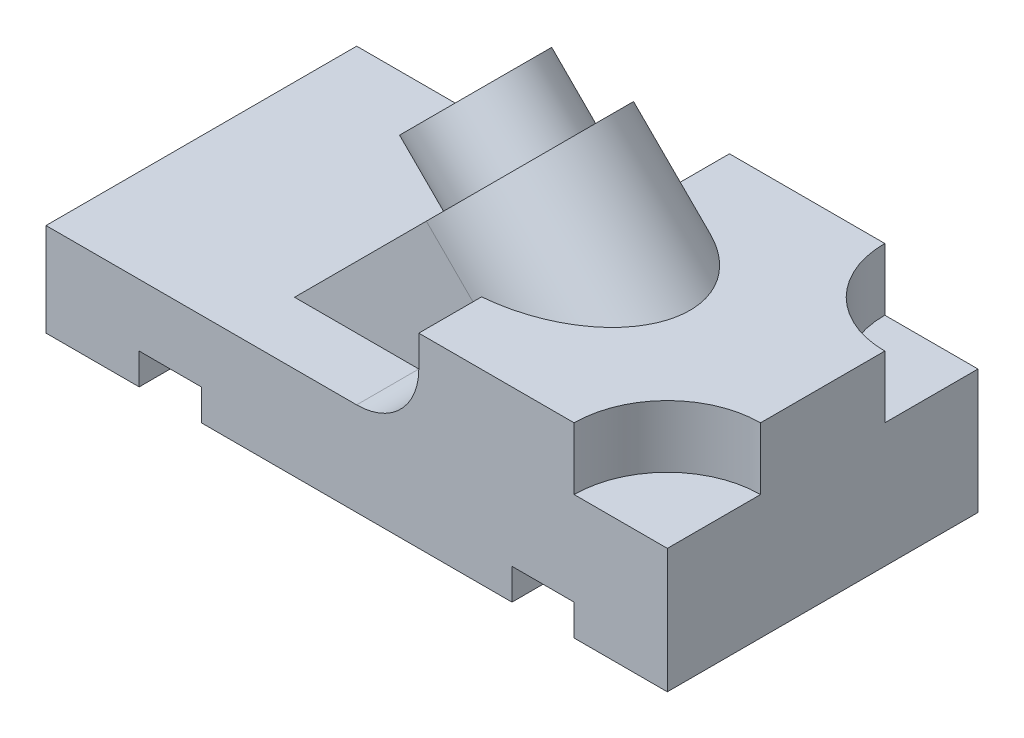
ISO-10303-21;
HEADER;
FILE_DESCRIPTION(('STEP AP214'),'2;1');
FILE_NAME('part.step','',(''),(''),'','','');
FILE_SCHEMA(('AUTOMOTIVE_DESIGN { 1 0 10303 214 1 1 1 1 }'));
ENDSEC;
DATA;
#1=APPLICATION_CONTEXT('core data for automotive mechanical design processes');
#2=APPLICATION_PROTOCOL_DEFINITION('international standard','automotive_design',2000,#1);
#3=PRODUCT_CONTEXT('',#1,'mechanical');
#4=PRODUCT('Part','Part','',(#3));
#5=PRODUCT_RELATED_PRODUCT_CATEGORY('part','',(#4));
#6=PRODUCT_DEFINITION_FORMATION('','',#4);
#7=PRODUCT_DEFINITION_CONTEXT('part definition',#1,'design');
#8=PRODUCT_DEFINITION('design','',#6,#7);
#9=PRODUCT_DEFINITION_SHAPE('','',#8);
#10=(LENGTH_UNIT() NAMED_UNIT(*) SI_UNIT(.MILLI.,.METRE.));
#11=(NAMED_UNIT(*) PLANE_ANGLE_UNIT() SI_UNIT($,.RADIAN.));
#12=(NAMED_UNIT(*) SI_UNIT($,.STERADIAN.) SOLID_ANGLE_UNIT());
#13=UNCERTAINTY_MEASURE_WITH_UNIT(LENGTH_MEASURE(1.E-05),#10,'distance_accuracy_value','');
#14=(GEOMETRIC_REPRESENTATION_CONTEXT(3) GLOBAL_UNCERTAINTY_ASSIGNED_CONTEXT((#13)) GLOBAL_UNIT_ASSIGNED_CONTEXT((#10,
#11,#12)) REPRESENTATION_CONTEXT('',''));
#15=CARTESIAN_POINT('',(0.,0.,0.));
#16=DIRECTION('',(0.,0.,1.));
#17=DIRECTION('',(1.,0.,0.));
#18=AXIS2_PLACEMENT_3D('',#15,#16,#17);
#19=CARTESIAN_POINT('',(0.,0.,-50.));
#20=DIRECTION('',(0.,-1.,0.));
#21=DIRECTION('',(0.,0.,-1.));
#22=AXIS2_PLACEMENT_3D('',#19,#20,#21);
#23=PLANE('',#22);
#24=DIRECTION('',(1.,0.,0.));
#25=VECTOR('',#24,1.);
#26=CARTESIAN_POINT('',(0.,0.,0.));
#27=LINE('',#26,#25);
#28=CARTESIAN_POINT('',(25.,0.,0.));
#29=VERTEX_POINT('',#28);
#30=CARTESIAN_POINT('',(75.,0.,0.));
#31=VERTEX_POINT('',#30);
#32=EDGE_CURVE('E366',#29,#31,#27,.T.);
#33=ORIENTED_EDGE('',*,*,#32,.F.);
#34=DIRECTION('',(0.,0.,1.));
#35=VECTOR('',#34,1.);
#36=CARTESIAN_POINT('',(25.,0.,-50.));
#37=LINE('',#36,#35);
#38=CARTESIAN_POINT('',(25.,0.,-50.));
#39=VERTEX_POINT('',#38);
#40=EDGE_CURVE('E242',#39,#29,#37,.T.);
#41=ORIENTED_EDGE('',*,*,#40,.F.);
#42=DIRECTION('',(1.,0.,0.));
#43=VECTOR('',#42,1.);
#44=CARTESIAN_POINT('',(0.,0.,-50.));
#45=LINE('',#44,#43);
#46=CARTESIAN_POINT('',(75.,0.,-50.));
#47=VERTEX_POINT('',#46);
#48=EDGE_CURVE('E231',#39,#47,#45,.T.);
#49=ORIENTED_EDGE('',*,*,#48,.T.);
#50=DIRECTION('',(0.,0.,1.));
#51=VECTOR('',#50,1.);
#52=CARTESIAN_POINT('',(75.,0.,-50.));
#53=LINE('',#52,#51);
#54=EDGE_CURVE('E267',#47,#31,#53,.T.);
#55=ORIENTED_EDGE('',*,*,#54,.T.);
#56=EDGE_LOOP('',(#33,#41,#49,#55));
#57=FACE_BOUND('',#56,.T.);
#58=ADVANCED_FACE('F39',(#57),#23,.T.);
#59=CARTESIAN_POINT('',(0.,0.,-50.));
#60=VERTEX_POINT('',#59);
#61=CARTESIAN_POINT('',(15.,0.,-50.));
#62=VERTEX_POINT('',#61);
#63=EDGE_CURVE('E341',#60,#62,#45,.T.);
#64=ORIENTED_EDGE('',*,*,#63,.T.);
#65=DIRECTION('',(0.,0.,1.));
#66=VECTOR('',#65,1.);
#67=CARTESIAN_POINT('',(15.,0.,-50.));
#68=LINE('',#67,#66);
#69=CARTESIAN_POINT('',(15.,0.,0.));
#70=VERTEX_POINT('',#69);
#71=EDGE_CURVE('E245',#62,#70,#68,.T.);
#72=ORIENTED_EDGE('',*,*,#71,.T.);
#73=CARTESIAN_POINT('',(0.,0.,0.));
#74=VERTEX_POINT('',#73);
#75=EDGE_CURVE('E362',#74,#70,#27,.T.);
#76=ORIENTED_EDGE('',*,*,#75,.F.);
#77=DIRECTION('',(0.,0.,1.));
#78=VECTOR('',#77,1.);
#79=CARTESIAN_POINT('',(0.,0.,-50.));
#80=LINE('',#79,#78);
#81=EDGE_CURVE('E358',#60,#74,#80,.T.);
#82=ORIENTED_EDGE('',*,*,#81,.F.);
#83=EDGE_LOOP('',(#64,#72,#76,#82));
#84=FACE_BOUND('',#83,.T.);
#85=ADVANCED_FACE('F441',(#84),#23,.T.);
#86=DIRECTION('',(0.,0.,1.));
#87=VECTOR('',#86,1.);
#88=CARTESIAN_POINT('',(85.,0.,-50.));
#89=LINE('',#88,#87);
#90=CARTESIAN_POINT('',(85.,0.,-50.));
#91=VERTEX_POINT('',#90);
#92=CARTESIAN_POINT('',(85.,0.,0.));
#93=VERTEX_POINT('',#92);
#94=EDGE_CURVE('E265',#91,#93,#89,.T.);
#95=ORIENTED_EDGE('',*,*,#94,.F.);
#96=CARTESIAN_POINT('',(100.,0.,-50.));
#97=VERTEX_POINT('',#96);
#98=EDGE_CURVE('E339',#91,#97,#45,.T.);
#99=ORIENTED_EDGE('',*,*,#98,.T.);
#100=DIRECTION('',(0.,0.,1.));
#101=VECTOR('',#100,1.);
#102=CARTESIAN_POINT('',(100.,0.,-50.));
#103=LINE('',#102,#101);
#104=CARTESIAN_POINT('',(100.,0.,0.));
#105=VERTEX_POINT('',#104);
#106=EDGE_CURVE('E397',#97,#105,#103,.T.);
#107=ORIENTED_EDGE('',*,*,#106,.T.);
#108=EDGE_CURVE('E361',#93,#105,#27,.T.);
#109=ORIENTED_EDGE('',*,*,#108,.F.);
#110=EDGE_LOOP('',(#95,#99,#107,#109));
#111=FACE_BOUND('',#110,.T.);
#112=ADVANCED_FACE('F430',(#111),#23,.T.);
#113=CARTESIAN_POINT('',(50.,25.,-50.));
#114=DIRECTION('',(0.,0.,-1.));
#115=DIRECTION('',(-1.,0.,0.));
#116=AXIS2_PLACEMENT_3D('',#113,#114,#115);
#117=PLANE('',#116);
#118=ORIENTED_EDGE('',*,*,#48,.F.);
#119=DIRECTION('',(0.,-1.,0.));
#120=VECTOR('',#119,1.);
#121=CARTESIAN_POINT('',(25.,0.,-50.));
#122=LINE('',#121,#120);
#123=CARTESIAN_POINT('',(25.,5.,-50.));
#124=VERTEX_POINT('',#123);
#125=EDGE_CURVE('E222',#124,#39,#122,.T.);
#126=ORIENTED_EDGE('',*,*,#125,.F.);
#127=DIRECTION('',(1.,0.,0.));
#128=VECTOR('',#127,1.);
#129=CARTESIAN_POINT('',(0.,4.99999999999999,-50.));
#130=LINE('',#129,#128);
#131=CARTESIAN_POINT('',(15.,5.,-50.));
#132=VERTEX_POINT('',#131);
#133=EDGE_CURVE('E212',#132,#124,#130,.T.);
#134=ORIENTED_EDGE('',*,*,#133,.F.);
#135=DIRECTION('',(0.,1.,0.));
#136=VECTOR('',#135,1.);
#137=CARTESIAN_POINT('',(15.,0.,-50.));
#138=LINE('',#137,#136);
#139=EDGE_CURVE('E221',#62,#132,#138,.T.);
#140=ORIENTED_EDGE('',*,*,#139,.F.);
#141=ORIENTED_EDGE('',*,*,#63,.F.);
#142=DIRECTION('',(0.,-1.,0.));
#143=VECTOR('',#142,1.);
#144=CARTESIAN_POINT('',(0.,15.,-50.));
#145=LINE('',#144,#143);
#146=CARTESIAN_POINT('',(0.,15.,-50.));
#147=VERTEX_POINT('',#146);
#148=EDGE_CURVE('E336',#147,#60,#145,.T.);
#149=ORIENTED_EDGE('',*,*,#148,.F.);
#150=DIRECTION('',(-1.,0.,0.));
#151=VECTOR('',#150,1.);
#152=CARTESIAN_POINT('',(49.9999999999999,15.,-50.));
#153=LINE('',#152,#151);
#154=CARTESIAN_POINT('',(49.9999999999999,15.,-50.));
#155=VERTEX_POINT('',#154);
#156=EDGE_CURVE('E355',#155,#147,#153,.T.);
#157=ORIENTED_EDGE('',*,*,#156,.F.);
#158=CARTESIAN_POINT('',(50.,25.,-50.));
#159=DIRECTION('',(0.,0.,-1.));
#160=DIRECTION('',(-1.,0.,0.));
#161=AXIS2_PLACEMENT_3D('',#158,#159,#160);
#162=CIRCLE('',#161,10.);
#163=CARTESIAN_POINT('',(60.,25.0000000000001,-50.));
#164=VERTEX_POINT('',#163);
#165=EDGE_CURVE('E352',#164,#155,#162,.T.);
#166=ORIENTED_EDGE('',*,*,#165,.F.);
#167=DIRECTION('',(0.,-1.,0.));
#168=VECTOR('',#167,1.);
#169=CARTESIAN_POINT('',(60.,30.,-50.));
#170=LINE('',#169,#168);
#171=CARTESIAN_POINT('',(60.,30.,-50.));
#172=VERTEX_POINT('',#171);
#173=EDGE_CURVE('E349',#172,#164,#170,.T.);
#174=ORIENTED_EDGE('',*,*,#173,.F.);
#175=DIRECTION('',(-1.,0.,0.));
#176=VECTOR('',#175,1.);
#177=CARTESIAN_POINT('',(100.,30.,-50.));
#178=LINE('',#177,#176);
#179=CARTESIAN_POINT('',(85.,30.,-50.));
#180=VERTEX_POINT('',#179);
#181=EDGE_CURVE('E347',#180,#172,#178,.T.);
#182=ORIENTED_EDGE('',*,*,#181,.F.);
#183=DIRECTION('',(0.,1.,0.));
#184=VECTOR('',#183,1.);
#185=CARTESIAN_POINT('',(85.,20.,-50.));
#186=LINE('',#185,#184);
#187=CARTESIAN_POINT('',(85.,20.,-50.));
#188=VERTEX_POINT('',#187);
#189=EDGE_CURVE('E11',#188,#180,#186,.T.);
#190=ORIENTED_EDGE('',*,*,#189,.F.);
#191=DIRECTION('',(1.,0.,0.));
#192=VECTOR('',#191,1.);
#193=CARTESIAN_POINT('',(50.,20.,-50.));
#194=LINE('',#193,#192);
#195=CARTESIAN_POINT('',(100.,20.,-50.));
#196=VERTEX_POINT('',#195);
#197=EDGE_CURVE('E47',#188,#196,#194,.T.);
#198=ORIENTED_EDGE('',*,*,#197,.T.);
#199=DIRECTION('',(0.,1.,0.));
#200=VECTOR('',#199,1.);
#201=CARTESIAN_POINT('',(100.,0.,-50.));
#202=LINE('',#201,#200);
#203=EDGE_CURVE('E344',#97,#196,#202,.T.);
#204=ORIENTED_EDGE('',*,*,#203,.F.);
#205=ORIENTED_EDGE('',*,*,#98,.F.);
#206=DIRECTION('',(0.,1.,0.));
#207=VECTOR('',#206,1.);
#208=CARTESIAN_POINT('',(85.,0.,-50.));
#209=LINE('',#208,#207);
#210=CARTESIAN_POINT('',(85.,5.,-50.));
#211=VERTEX_POINT('',#210);
#212=EDGE_CURVE('E255',#91,#211,#209,.T.);
#213=ORIENTED_EDGE('',*,*,#212,.T.);
#214=DIRECTION('',(-1.,0.,0.));
#215=VECTOR('',#214,1.);
#216=CARTESIAN_POINT('',(0.,5.00000000000001,-50.));
#217=LINE('',#216,#215);
#218=CARTESIAN_POINT('',(75.,5.,-50.));
#219=VERTEX_POINT('',#218);
#220=EDGE_CURVE('E249',#211,#219,#217,.T.);
#221=ORIENTED_EDGE('',*,*,#220,.T.);
#222=DIRECTION('',(0.,-1.,0.));
#223=VECTOR('',#222,1.);
#224=CARTESIAN_POINT('',(75.,0.,-50.));
#225=LINE('',#224,#223);
#226=EDGE_CURVE('E252',#219,#47,#225,.T.);
#227=ORIENTED_EDGE('',*,*,#226,.T.);
#228=EDGE_LOOP('',(#118,#126,#134,#140,#141,#149,#157,#166,#174,#182,#190,#198,#204,#205,#213,
#221,#227));
#229=FACE_BOUND('',#228,.T.);
#230=ADVANCED_FACE('F228',(#229),#117,.T.);
#231=CARTESIAN_POINT('',(50.,25.,0.));
#232=DIRECTION('',(0.,0.,-1.));
#233=DIRECTION('',(-1.,0.,0.));
#234=AXIS2_PLACEMENT_3D('',#231,#232,#233);
#235=PLANE('',#234);
#236=DIRECTION('',(0.,-1.,0.));
#237=VECTOR('',#236,1.);
#238=CARTESIAN_POINT('',(25.,0.,0.));
#239=LINE('',#238,#237);
#240=CARTESIAN_POINT('',(25.,5.,0.));
#241=VERTEX_POINT('',#240);
#242=EDGE_CURVE('E54',#241,#29,#239,.T.);
#243=ORIENTED_EDGE('',*,*,#242,.T.);
#244=ORIENTED_EDGE('',*,*,#32,.T.);
#245=DIRECTION('',(0.,-1.,0.));
#246=VECTOR('',#245,1.);
#247=CARTESIAN_POINT('',(75.,0.,0.));
#248=LINE('',#247,#246);
#249=CARTESIAN_POINT('',(75.,5.,0.));
#250=VERTEX_POINT('',#249);
#251=EDGE_CURVE('E260',#250,#31,#248,.T.);
#252=ORIENTED_EDGE('',*,*,#251,.F.);
#253=DIRECTION('',(-1.,0.,0.));
#254=VECTOR('',#253,1.);
#255=CARTESIAN_POINT('',(0.,5.00000000000001,0.));
#256=LINE('',#255,#254);
#257=CARTESIAN_POINT('',(85.,5.,0.));
#258=VERTEX_POINT('',#257);
#259=EDGE_CURVE('E62',#258,#250,#256,.T.);
#260=ORIENTED_EDGE('',*,*,#259,.F.);
#261=DIRECTION('',(0.,1.,0.));
#262=VECTOR('',#261,1.);
#263=CARTESIAN_POINT('',(85.,0.,0.));
#264=LINE('',#263,#262);
#265=EDGE_CURVE('E253',#93,#258,#264,.T.);
#266=ORIENTED_EDGE('',*,*,#265,.F.);
#267=ORIENTED_EDGE('',*,*,#108,.T.);
#268=DIRECTION('',(0.,1.,0.));
#269=VECTOR('',#268,1.);
#270=CARTESIAN_POINT('',(100.,0.,0.));
#271=LINE('',#270,#269);
#272=CARTESIAN_POINT('',(100.,20.,0.));
#273=VERTEX_POINT('',#272);
#274=EDGE_CURVE('E365',#105,#273,#271,.T.);
#275=ORIENTED_EDGE('',*,*,#274,.T.);
#276=DIRECTION('',(1.,0.,0.));
#277=VECTOR('',#276,1.);
#278=CARTESIAN_POINT('',(50.,20.,0.));
#279=LINE('',#278,#277);
#280=CARTESIAN_POINT('',(85.,20.,0.));
#281=VERTEX_POINT('',#280);
#282=EDGE_CURVE('E411',#281,#273,#279,.T.);
#283=ORIENTED_EDGE('',*,*,#282,.F.);
#284=DIRECTION('',(0.,1.,0.));
#285=VECTOR('',#284,1.);
#286=CARTESIAN_POINT('',(85.,20.,0.));
#287=LINE('',#286,#285);
#288=CARTESIAN_POINT('',(85.,30.,0.));
#289=VERTEX_POINT('',#288);
#290=EDGE_CURVE('E413',#281,#289,#287,.T.);
#291=ORIENTED_EDGE('',*,*,#290,.T.);
#292=DIRECTION('',(-1.,0.,0.));
#293=VECTOR('',#292,1.);
#294=CARTESIAN_POINT('',(100.,30.,0.));
#295=LINE('',#294,#293);
#296=CARTESIAN_POINT('',(60.,30.,0.));
#297=VERTEX_POINT('',#296);
#298=EDGE_CURVE('E369',#289,#297,#295,.T.);
#299=ORIENTED_EDGE('',*,*,#298,.T.);
#300=DIRECTION('',(0.,-1.,0.));
#301=VECTOR('',#300,1.);
#302=CARTESIAN_POINT('',(60.,30.,0.));
#303=LINE('',#302,#301);
#304=CARTESIAN_POINT('',(60.,25.0000000000001,0.));
#305=VERTEX_POINT('',#304);
#306=EDGE_CURVE('E371',#297,#305,#303,.T.);
#307=ORIENTED_EDGE('',*,*,#306,.T.);
#308=CARTESIAN_POINT('',(50.,25.,0.));
#309=DIRECTION('',(0.,0.,-1.));
#310=DIRECTION('',(-1.,0.,0.));
#311=AXIS2_PLACEMENT_3D('',#308,#309,#310);
#312=CIRCLE('',#311,10.);
#313=CARTESIAN_POINT('',(49.9999999999999,15.,0.));
#314=VERTEX_POINT('',#313);
#315=EDGE_CURVE('E374',#305,#314,#312,.T.);
#316=ORIENTED_EDGE('',*,*,#315,.T.);
#317=DIRECTION('',(-1.,0.,0.));
#318=VECTOR('',#317,1.);
#319=CARTESIAN_POINT('',(49.9999999999999,15.,0.));
#320=LINE('',#319,#318);
#321=CARTESIAN_POINT('',(0.,15.,0.));
#322=VERTEX_POINT('',#321);
#323=EDGE_CURVE('E340',#314,#322,#320,.T.);
#324=ORIENTED_EDGE('',*,*,#323,.T.);
#325=DIRECTION('',(0.,-1.,0.));
#326=VECTOR('',#325,1.);
#327=CARTESIAN_POINT('',(0.,15.,0.));
#328=LINE('',#327,#326);
#329=EDGE_CURVE('E335',#322,#74,#328,.T.);
#330=ORIENTED_EDGE('',*,*,#329,.T.);
#331=ORIENTED_EDGE('',*,*,#75,.T.);
#332=DIRECTION('',(0.,1.,0.));
#333=VECTOR('',#332,1.);
#334=CARTESIAN_POINT('',(15.,0.,0.));
#335=LINE('',#334,#333);
#336=CARTESIAN_POINT('',(15.,5.,0.));
#337=VERTEX_POINT('',#336);
#338=EDGE_CURVE('E232',#70,#337,#335,.T.);
#339=ORIENTED_EDGE('',*,*,#338,.T.);
#340=DIRECTION('',(1.,0.,0.));
#341=VECTOR('',#340,1.);
#342=CARTESIAN_POINT('',(0.,4.99999999999999,0.));
#343=LINE('',#342,#341);
#344=EDGE_CURVE('E235',#337,#241,#343,.T.);
#345=ORIENTED_EDGE('',*,*,#344,.T.);
#346=EDGE_LOOP('',(#243,#244,#252,#260,#266,#267,#275,#283,#291,#299,#307,#316,#324,#330,#331,
#339,#345));
#347=FACE_BOUND('',#346,.T.);
#348=ADVANCED_FACE('F435',(#347),#235,.F.);
#349=CARTESIAN_POINT('',(49.9999999999999,15.,-50.));
#350=DIRECTION('',(0.,1.,0.));
#351=DIRECTION('',(-1.,0.,0.));
#352=AXIS2_PLACEMENT_3D('',#349,#350,#351);
#353=PLANE('',#352);
#354=DIRECTION('',(0.,0.,-1.));
#355=VECTOR('',#354,1.);
#356=CARTESIAN_POINT('',(30.0099519127002,15.,0.));
#357=LINE('',#356,#355);
#358=CARTESIAN_POINT('',(30.0099519127002,15.,-10.));
#359=VERTEX_POINT('',#358);
#360=CARTESIAN_POINT('',(30.0099519127003,15.,-40.));
#361=VERTEX_POINT('',#360);
#362=EDGE_CURVE('E301',#359,#361,#357,.T.);
#363=ORIENTED_EDGE('',*,*,#362,.T.);
#364=DIRECTION('',(-1.,0.,0.));
#365=VECTOR('',#364,1.);
#366=CARTESIAN_POINT('',(69.5778362750006,15.,-40.));
#367=LINE('',#366,#365);
#368=CARTESIAN_POINT('',(50.,15.,-40.));
#369=VERTEX_POINT('',#368);
#370=EDGE_CURVE('E299',#369,#361,#367,.T.);
#371=ORIENTED_EDGE('',*,*,#370,.F.);
#372=DIRECTION('',(0.,0.,1.));
#373=VECTOR('',#372,1.);
#374=CARTESIAN_POINT('',(49.9999999999999,15.,-50.));
#375=LINE('',#374,#373);
#376=EDGE_CURVE('E382',#155,#369,#375,.T.);
#377=ORIENTED_EDGE('',*,*,#376,.F.);
#378=ORIENTED_EDGE('',*,*,#156,.T.);
#379=DIRECTION('',(0.,0.,1.));
#380=VECTOR('',#379,1.);
#381=CARTESIAN_POINT('',(0.,15.,-50.));
#382=LINE('',#381,#380);
#383=EDGE_CURVE('E379',#147,#322,#382,.T.);
#384=ORIENTED_EDGE('',*,*,#383,.T.);
#385=ORIENTED_EDGE('',*,*,#323,.F.);
#386=CARTESIAN_POINT('',(50.,15.,-10.));
#387=VERTEX_POINT('',#386);
#388=EDGE_CURVE('E385',#387,#314,#375,.T.);
#389=ORIENTED_EDGE('',*,*,#388,.F.);
#390=DIRECTION('',(-1.,0.,0.));
#391=VECTOR('',#390,1.);
#392=CARTESIAN_POINT('',(69.5778362750005,15.,-10.));
#393=LINE('',#392,#391);
#394=EDGE_CURVE('E305',#387,#359,#393,.T.);
#395=ORIENTED_EDGE('',*,*,#394,.T.);
#396=EDGE_LOOP('',(#363,#371,#377,#378,#384,#385,#389,#395));
#397=FACE_BOUND('',#396,.T.);
#398=ADVANCED_FACE('F449',(#397),#353,.T.);
#399=CARTESIAN_POINT('',(50.,25.,-50.));
#400=DIRECTION('',(0.,0.,1.));
#401=DIRECTION('',(1.,0.,0.));
#402=AXIS2_PLACEMENT_3D('',#399,#400,#401);
#403=CYLINDRICAL_SURFACE('',#402,10.);
#404=ORIENTED_EDGE('',*,*,#376,.T.);
#405=CARTESIAN_POINT('',(50.,25.,-40.));
#406=DIRECTION('',(0.,0.,1.));
#407=DIRECTION('',(1.,0.,0.));
#408=AXIS2_PLACEMENT_3D('',#405,#406,#407);
#409=CIRCLE('',#408,10.);
#410=CARTESIAN_POINT('',(60.,25.0000000000001,-40.));
#411=VERTEX_POINT('',#410);
#412=EDGE_CURVE('E332',#369,#411,#409,.T.);
#413=ORIENTED_EDGE('',*,*,#412,.T.);
#414=DIRECTION('',(0.,0.,1.));
#415=VECTOR('',#414,1.);
#416=CARTESIAN_POINT('',(60.,25.0000000000001,-50.));
#417=LINE('',#416,#415);
#418=EDGE_CURVE('E386',#164,#411,#417,.T.);
#419=ORIENTED_EDGE('',*,*,#418,.F.);
#420=ORIENTED_EDGE('',*,*,#165,.T.);
#421=EDGE_LOOP('',(#404,#413,#419,#420));
#422=FACE_BOUND('',#421,.T.);
#423=ADVANCED_FACE('F507',(#422),#403,.F.);
#424=CARTESIAN_POINT('',(60.,30.,-50.));
#425=DIRECTION('',(-1.,0.,0.));
#426=DIRECTION('',(0.,0.,1.));
#427=AXIS2_PLACEMENT_3D('',#424,#425,#426);
#428=PLANE('',#427);
#429=DIRECTION('',(0.,1.,0.));
#430=VECTOR('',#429,1.);
#431=CARTESIAN_POINT('',(60.,30.,-40.));
#432=LINE('',#431,#430);
#433=CARTESIAN_POINT('',(60.,27.4363587838932,-40.));
#434=VERTEX_POINT('',#433);
#435=EDGE_CURVE('E405',#411,#434,#432,.T.);
#436=ORIENTED_EDGE('',*,*,#435,.T.);
#437=CARTESIAN_POINT('',(60.,27.4363587838931,-25.));
#438=DIRECTION('',(-1.,0.,0.));
#439=DIRECTION('',(0.,1.,0.));
#440=AXIS2_PLACEMENT_3D('',#437,#438,#439);
#441=ELLIPSE('',#440,21.2132034355964,15.);
#442=CARTESIAN_POINT('',(60.,30.,-39.8900594981195));
#443=VERTEX_POINT('',#442);
#444=EDGE_CURVE('E308',#434,#443,#441,.F.);
#445=ORIENTED_EDGE('',*,*,#444,.T.);
#446=DIRECTION('',(0.,0.,1.));
#447=VECTOR('',#446,1.);
#448=CARTESIAN_POINT('',(60.,30.,-50.));
#449=LINE('',#448,#447);
#450=EDGE_CURVE('E390',#172,#443,#449,.T.);
#451=ORIENTED_EDGE('',*,*,#450,.F.);
#452=ORIENTED_EDGE('',*,*,#173,.T.);
#453=ORIENTED_EDGE('',*,*,#418,.T.);
#454=EDGE_LOOP('',(#436,#445,#451,#452,#453));
#455=FACE_BOUND('',#454,.T.);
#456=ADVANCED_FACE('F457',(#455),#428,.T.);
#457=CARTESIAN_POINT('',(60.,30.,-10.1099405018805));
#458=VERTEX_POINT('',#457);
#459=EDGE_CURVE('E393',#458,#297,#449,.T.);
#460=ORIENTED_EDGE('',*,*,#459,.F.);
#461=CARTESIAN_POINT('',(60.,27.4363587838931,-10.));
#462=VERTEX_POINT('',#461);
#463=EDGE_CURVE('E329',#458,#462,#441,.F.);
#464=ORIENTED_EDGE('',*,*,#463,.T.);
#465=DIRECTION('',(0.,1.,0.));
#466=VECTOR('',#465,1.);
#467=CARTESIAN_POINT('',(60.,30.,-10.));
#468=LINE('',#467,#466);
#469=CARTESIAN_POINT('',(60.,25.0000000000001,-10.));
#470=VERTEX_POINT('',#469);
#471=EDGE_CURVE('E403',#470,#462,#468,.T.);
#472=ORIENTED_EDGE('',*,*,#471,.F.);
#473=EDGE_CURVE('E389',#470,#305,#417,.T.);
#474=ORIENTED_EDGE('',*,*,#473,.T.);
#475=ORIENTED_EDGE('',*,*,#306,.F.);
#476=EDGE_LOOP('',(#460,#464,#472,#474,#475));
#477=FACE_BOUND('',#476,.T.);
#478=ADVANCED_FACE('F514',(#477),#428,.T.);
#479=CARTESIAN_POINT('',(0.,15.,-50.));
#480=DIRECTION('',(-1.,0.,0.));
#481=DIRECTION('',(0.,-1.,0.));
#482=AXIS2_PLACEMENT_3D('',#479,#480,#481);
#483=PLANE('',#482);
#484=ORIENTED_EDGE('',*,*,#329,.F.);
#485=ORIENTED_EDGE('',*,*,#383,.F.);
#486=ORIENTED_EDGE('',*,*,#148,.T.);
#487=ORIENTED_EDGE('',*,*,#81,.T.);
#488=EDGE_LOOP('',(#484,#485,#486,#487));
#489=FACE_BOUND('',#488,.T.);
#490=ADVANCED_FACE('F41',(#489),#483,.T.);
#491=CARTESIAN_POINT('',(50.,25.,-10.));
#492=DIRECTION('',(0.,0.,1.));
#493=DIRECTION('',(1.,0.,0.));
#494=AXIS2_PLACEMENT_3D('',#491,#492,#493);
#495=CIRCLE('',#494,10.);
#496=EDGE_CURVE('E330',#387,#470,#495,.T.);
#497=ORIENTED_EDGE('',*,*,#496,.F.);
#498=ORIENTED_EDGE('',*,*,#388,.T.);
#499=ORIENTED_EDGE('',*,*,#315,.F.);
#500=ORIENTED_EDGE('',*,*,#473,.F.);
#501=EDGE_LOOP('',(#497,#498,#499,#500));
#502=FACE_BOUND('',#501,.T.);
#503=ADVANCED_FACE('F508',(#502),#403,.F.);
#504=CARTESIAN_POINT('',(100.,30.,-50.));
#505=DIRECTION('',(0.,1.,0.));
#506=DIRECTION('',(-1.,0.,0.));
#507=AXIS2_PLACEMENT_3D('',#504,#505,#506);
#508=PLANE('',#507);
#509=CARTESIAN_POINT('',(100.,30.,-50.));
#510=DIRECTION('',(0.,1.,0.));
#511=DIRECTION('',(-1.,0.,0.));
#512=AXIS2_PLACEMENT_3D('',#509,#510,#511);
#513=CIRCLE('',#512,15.);
#514=CARTESIAN_POINT('',(100.,30.,-35.));
#515=VERTEX_POINT('',#514);
#516=EDGE_CURVE('E275',#180,#515,#513,.T.);
#517=ORIENTED_EDGE('',*,*,#516,.F.);
#518=ORIENTED_EDGE('',*,*,#181,.T.);
#519=ORIENTED_EDGE('',*,*,#450,.T.);
#520=CARTESIAN_POINT('',(57.4363587838931,30.,-25.));
#521=DIRECTION('',(0.,1.,0.));
#522=DIRECTION('',(-1.,0.,0.));
#523=AXIS2_PLACEMENT_3D('',#520,#521,#522);
#524=ELLIPSE('',#523,21.2132034355965,15.);
#525=EDGE_CURVE('E381',#443,#458,#524,.F.);
#526=ORIENTED_EDGE('',*,*,#525,.T.);
#527=ORIENTED_EDGE('',*,*,#459,.T.);
#528=ORIENTED_EDGE('',*,*,#298,.F.);
#529=CARTESIAN_POINT('',(100.,30.,0.));
#530=DIRECTION('',(0.,1.,0.));
#531=DIRECTION('',(-1.,0.,0.));
#532=AXIS2_PLACEMENT_3D('',#529,#530,#531);
#533=CIRCLE('',#532,15.);
#534=CARTESIAN_POINT('',(100.,30.,-15.));
#535=VERTEX_POINT('',#534);
#536=EDGE_CURVE('E244',#535,#289,#533,.T.);
#537=ORIENTED_EDGE('',*,*,#536,.F.);
#538=DIRECTION('',(0.,0.,1.));
#539=VECTOR('',#538,1.);
#540=CARTESIAN_POINT('',(100.,30.,-50.));
#541=LINE('',#540,#539);
#542=EDGE_CURVE('E394',#515,#535,#541,.T.);
#543=ORIENTED_EDGE('',*,*,#542,.F.);
#544=EDGE_LOOP('',(#517,#518,#519,#526,#527,#528,#537,#543));
#545=FACE_BOUND('',#544,.T.);
#546=ADVANCED_FACE('F460',(#545),#508,.T.);
#547=CARTESIAN_POINT('',(100.,0.,-50.));
#548=DIRECTION('',(1.,0.,0.));
#549=DIRECTION('',(0.,0.,-1.));
#550=AXIS2_PLACEMENT_3D('',#547,#548,#549);
#551=PLANE('',#550);
#552=DIRECTION('',(0.,1.,0.));
#553=VECTOR('',#552,1.);
#554=CARTESIAN_POINT('',(100.,20.,-35.));
#555=LINE('',#554,#553);
#556=CARTESIAN_POINT('',(100.,20.,-35.));
#557=VERTEX_POINT('',#556);
#558=EDGE_CURVE('E287',#515,#557,#555,.F.);
#559=ORIENTED_EDGE('',*,*,#558,.F.);
#560=ORIENTED_EDGE('',*,*,#542,.T.);
#561=DIRECTION('',(0.,1.,0.));
#562=VECTOR('',#561,1.);
#563=CARTESIAN_POINT('',(100.,20.,-15.));
#564=LINE('',#563,#562);
#565=CARTESIAN_POINT('',(100.,20.,-15.));
#566=VERTEX_POINT('',#565);
#567=EDGE_CURVE('E282',#566,#535,#564,.T.);
#568=ORIENTED_EDGE('',*,*,#567,.F.);
#569=DIRECTION('',(0.,0.,1.));
#570=VECTOR('',#569,1.);
#571=CARTESIAN_POINT('',(100.,20.,-50.));
#572=LINE('',#571,#570);
#573=EDGE_CURVE('E274',#566,#273,#572,.T.);
#574=ORIENTED_EDGE('',*,*,#573,.T.);
#575=ORIENTED_EDGE('',*,*,#274,.F.);
#576=ORIENTED_EDGE('',*,*,#106,.F.);
#577=ORIENTED_EDGE('',*,*,#203,.T.);
#578=DIRECTION('',(0.,0.,1.));
#579=VECTOR('',#578,1.);
#580=CARTESIAN_POINT('',(100.,20.,-50.));
#581=LINE('',#580,#579);
#582=EDGE_CURVE('E284',#196,#557,#581,.T.);
#583=ORIENTED_EDGE('',*,*,#582,.T.);
#584=EDGE_LOOP('',(#559,#560,#568,#574,#575,#576,#577,#583));
#585=FACE_BOUND('',#584,.T.);
#586=ADVANCED_FACE('F425',(#585),#551,.T.);
#587=CARTESIAN_POINT('',(7.50000000000005,-7.50000000000002,0.));
#588=DIRECTION('',(-0.707106781186549,0.707106781186546,0.));
#589=DIRECTION('',(-0.707106781186546,-0.707106781186549,0.));
#590=AXIS2_PLACEMENT_3D('',#587,#588,#589);
#591=PLANE('',#590);
#592=CARTESIAN_POINT('',(51.2181793919465,36.2181793919466,-25.));
#593=DIRECTION('',(-0.707106781186549,0.707106781186546,0.));
#594=DIRECTION('',(-0.707106781186546,-0.707106781186549,0.));
#595=AXIS2_PLACEMENT_3D('',#592,#593,#594);
#596=CIRCLE('',#595,9.99999999999999);
#597=CARTESIAN_POINT('',(44.1471115800811,29.1471115800811,-25.));
#598=VERTEX_POINT('',#597);
#599=EDGE_CURVE('E292',#598,#598,#596,.T.);
#600=ORIENTED_EDGE('',*,*,#599,.F.);
#601=EDGE_LOOP('',(#600));
#602=FACE_BOUND('',#601,.T.);
#603=DIRECTION('',(0.707106781186546,0.707106781186549,0.));
#604=VECTOR('',#603,1.);
#605=CARTESIAN_POINT('',(7.50000000000005,-7.50000000000003,-10.));
#606=LINE('',#605,#604);
#607=CARTESIAN_POINT('',(30.0049759563501,15.0049759563501,-10.));
#608=VERTEX_POINT('',#607);
#609=CARTESIAN_POINT('',(51.2181793919465,36.2181793919466,-10.));
#610=VERTEX_POINT('',#609);
#611=EDGE_CURVE('E296',#608,#610,#606,.T.);
#612=ORIENTED_EDGE('',*,*,#611,.T.);
#613=CARTESIAN_POINT('',(51.2181793919465,36.2181793919466,-25.));
#614=DIRECTION('',(-0.707106781186549,0.707106781186546,0.));
#615=DIRECTION('',(-0.707106781186546,-0.707106781186549,0.));
#616=AXIS2_PLACEMENT_3D('',#613,#614,#615);
#617=CIRCLE('',#616,15.);
#618=CARTESIAN_POINT('',(51.2181793919465,36.2181793919466,-40.));
#619=VERTEX_POINT('',#618);
#620=EDGE_CURVE('E311',#619,#610,#617,.F.);
#621=ORIENTED_EDGE('',*,*,#620,.F.);
#622=DIRECTION('',(0.707106781186546,0.707106781186549,0.));
#623=VECTOR('',#622,1.);
#624=CARTESIAN_POINT('',(7.50000000000006,-7.50000000000003,-40.));
#625=LINE('',#624,#623);
#626=CARTESIAN_POINT('',(30.0049759563501,15.0049759563501,-40.));
#627=VERTEX_POINT('',#626);
#628=EDGE_CURVE('E314',#627,#619,#625,.T.);
#629=ORIENTED_EDGE('',*,*,#628,.F.);
#630=DIRECTION('',(0.,0.,1.));
#631=VECTOR('',#630,1.);
#632=CARTESIAN_POINT('',(30.0049759563501,15.0049759563501,0.));
#633=LINE('',#632,#631);
#634=EDGE_CURVE('E317',#627,#608,#633,.T.);
#635=ORIENTED_EDGE('',*,*,#634,.T.);
#636=EDGE_LOOP('',(#612,#621,#629,#635));
#637=FACE_BOUND('',#636,.T.);
#638=ADVANCED_FACE('F517',(#602,#637),#591,.T.);
#639=CARTESIAN_POINT('',(113.296015666947,-25.8596568830537,-25.));
#640=DIRECTION('',(-0.707106781186549,0.707106781186546,0.));
#641=DIRECTION('',(-0.707106781186546,-0.707106781186549,0.));
#642=AXIS2_PLACEMENT_3D('',#639,#640,#641);
#643=CYLINDRICAL_SURFACE('',#642,15.);
#644=ORIENTED_EDGE('',*,*,#463,.F.);
#645=ORIENTED_EDGE('',*,*,#525,.F.);
#646=ORIENTED_EDGE('',*,*,#444,.F.);
#647=DIRECTION('',(-0.707106781186549,0.707106781186546,0.));
#648=VECTOR('',#647,1.);
#649=CARTESIAN_POINT('',(113.296015666947,-25.8596568830537,-40.));
#650=LINE('',#649,#648);
#651=EDGE_CURVE('E324',#434,#619,#650,.T.);
#652=ORIENTED_EDGE('',*,*,#651,.T.);
#653=ORIENTED_EDGE('',*,*,#620,.T.);
#654=DIRECTION('',(-0.707106781186549,0.707106781186546,0.));
#655=VECTOR('',#654,1.);
#656=CARTESIAN_POINT('',(113.296015666947,-25.8596568830537,-10.));
#657=LINE('',#656,#655);
#658=EDGE_CURVE('E320',#462,#610,#657,.T.);
#659=ORIENTED_EDGE('',*,*,#658,.F.);
#660=EDGE_LOOP('',(#644,#645,#646,#652,#653,#659));
#661=FACE_BOUND('',#660,.T.);
#662=ADVANCED_FACE('F521',(#661),#643,.T.);
#663=CARTESIAN_POINT('',(69.5778362750006,-69.5778362750003,-40.));
#664=DIRECTION('',(0.,0.,1.));
#665=DIRECTION('',(1.,0.,0.));
#666=AXIS2_PLACEMENT_3D('',#663,#664,#665);
#667=PLANE('',#666);
#668=ORIENTED_EDGE('',*,*,#412,.F.);
#669=ORIENTED_EDGE('',*,*,#370,.T.);
#670=DIRECTION('',(-0.707106781186549,0.707106781186546,0.));
#671=VECTOR('',#670,1.);
#672=CARTESIAN_POINT('',(92.0828122313506,-47.0728603186502,-40.));
#673=LINE('',#672,#671);
#674=EDGE_CURVE('E322',#361,#627,#673,.T.);
#675=ORIENTED_EDGE('',*,*,#674,.T.);
#676=ORIENTED_EDGE('',*,*,#628,.T.);
#677=ORIENTED_EDGE('',*,*,#651,.F.);
#678=ORIENTED_EDGE('',*,*,#435,.F.);
#679=EDGE_LOOP('',(#668,#669,#675,#676,#677,#678));
#680=FACE_BOUND('',#679,.T.);
#681=ADVANCED_FACE('F527',(#680),#667,.F.);
#682=CARTESIAN_POINT('',(92.0828122313506,-47.0728603186502,0.));
#683=DIRECTION('',(-0.707106781186546,-0.707106781186549,0.));
#684=DIRECTION('',(0.707106781186549,-0.707106781186546,0.));
#685=AXIS2_PLACEMENT_3D('',#682,#683,#684);
#686=PLANE('',#685);
#687=ORIENTED_EDGE('',*,*,#362,.F.);
#688=DIRECTION('',(-0.707106781186549,0.707106781186546,0.));
#689=VECTOR('',#688,1.);
#690=CARTESIAN_POINT('',(92.0828122313506,-47.0728603186502,-10.));
#691=LINE('',#690,#689);
#692=EDGE_CURVE('E302',#359,#608,#691,.T.);
#693=ORIENTED_EDGE('',*,*,#692,.T.);
#694=ORIENTED_EDGE('',*,*,#634,.F.);
#695=ORIENTED_EDGE('',*,*,#674,.F.);
#696=EDGE_LOOP('',(#687,#693,#694,#695));
#697=FACE_BOUND('',#696,.T.);
#698=ADVANCED_FACE('F555',(#697),#686,.T.);
#699=CARTESIAN_POINT('',(69.5778362750006,-69.5778362750003,-10.));
#700=DIRECTION('',(0.,0.,1.));
#701=DIRECTION('',(1.,0.,0.));
#702=AXIS2_PLACEMENT_3D('',#699,#700,#701);
#703=PLANE('',#702);
#704=ORIENTED_EDGE('',*,*,#394,.F.);
#705=ORIENTED_EDGE('',*,*,#496,.T.);
#706=ORIENTED_EDGE('',*,*,#471,.T.);
#707=ORIENTED_EDGE('',*,*,#658,.T.);
#708=ORIENTED_EDGE('',*,*,#611,.F.);
#709=ORIENTED_EDGE('',*,*,#692,.F.);
#710=EDGE_LOOP('',(#704,#705,#706,#707,#708,#709));
#711=FACE_BOUND('',#710,.T.);
#712=ADVANCED_FACE('F502',(#711),#703,.T.);
#713=CARTESIAN_POINT('',(44.147111580081,43.289247203812,-25.));
#714=DIRECTION('',(-0.707106781186549,0.707106781186546,0.));
#715=DIRECTION('',(-0.707106781186546,-0.707106781186549,0.));
#716=AXIS2_PLACEMENT_3D('',#713,#714,#715);
#717=PLANE('',#716);
#718=CARTESIAN_POINT('',(44.147111580081,43.289247203812,-25.));
#719=DIRECTION('',(-0.707106781186549,0.707106781186546,0.));
#720=DIRECTION('',(-0.707106781186546,-0.707106781186549,0.));
#721=AXIS2_PLACEMENT_3D('',#718,#719,#720);
#722=CIRCLE('',#721,9.99999999999999);
#723=CARTESIAN_POINT('',(37.0760437682156,36.2181793919466,-25.));
#724=VERTEX_POINT('',#723);
#725=EDGE_CURVE('E293',#724,#724,#722,.T.);
#726=ORIENTED_EDGE('',*,*,#725,.T.);
#727=EDGE_LOOP('',(#726));
#728=FACE_BOUND('',#727,.T.);
#729=CARTESIAN_POINT('',(44.147111580081,43.289247203812,-25.));
#730=DIRECTION('',(-0.707106781186549,0.707106781186546,0.));
#731=DIRECTION('',(-0.707106781186546,-0.707106781186549,0.));
#732=AXIS2_PLACEMENT_3D('',#729,#730,#731);
#733=CIRCLE('',#732,5.);
#734=CARTESIAN_POINT('',(40.6115776741483,39.7537132978793,-25.));
#735=VERTEX_POINT('',#734);
#736=EDGE_CURVE('E289',#735,#735,#733,.T.);
#737=ORIENTED_EDGE('',*,*,#736,.F.);
#738=EDGE_LOOP('',(#737));
#739=FACE_BOUND('',#738,.T.);
#740=ADVANCED_FACE('F547',(#728,#739),#717,.T.);
#741=CARTESIAN_POINT('',(44.147111580081,43.289247203812,-25.));
#742=DIRECTION('',(0.707106781186549,-0.707106781186546,0.));
#743=DIRECTION('',(0.707106781186546,0.707106781186549,0.));
#744=AXIS2_PLACEMENT_3D('',#741,#742,#743);
#745=CYLINDRICAL_SURFACE('',#744,9.99999999999999);
#746=ORIENTED_EDGE('',*,*,#725,.F.);
#747=EDGE_LOOP('',(#746));
#748=FACE_BOUND('',#747,.T.);
#749=ORIENTED_EDGE('',*,*,#599,.T.);
#750=EDGE_LOOP('',(#749));
#751=FACE_BOUND('',#750,.T.);
#752=ADVANCED_FACE('F539',(#748,#751),#745,.T.);
#753=CARTESIAN_POINT('',(44.147111580081,43.289247203812,-25.));
#754=DIRECTION('',(0.707106781186549,-0.707106781186546,0.));
#755=DIRECTION('',(0.707106781186546,0.707106781186549,0.));
#756=AXIS2_PLACEMENT_3D('',#753,#754,#755);
#757=CYLINDRICAL_SURFACE('',#756,5.);
#758=ORIENTED_EDGE('',*,*,#736,.T.);
#759=EDGE_LOOP('',(#758));
#760=FACE_BOUND('',#759,.T.);
#761=CARTESIAN_POINT('',(51.2181793919465,36.2181793919466,-25.));
#762=DIRECTION('',(-0.707106781186549,0.707106781186546,0.));
#763=DIRECTION('',(-0.707106781186546,-0.707106781186549,0.));
#764=AXIS2_PLACEMENT_3D('',#761,#762,#763);
#765=CIRCLE('',#764,5.);
#766=CARTESIAN_POINT('',(47.6826454860138,32.6826454860138,-25.));
#767=VERTEX_POINT('',#766);
#768=EDGE_CURVE('E408',#767,#767,#765,.F.);
#769=ORIENTED_EDGE('',*,*,#768,.T.);
#770=EDGE_LOOP('',(#769));
#771=FACE_BOUND('',#770,.T.);
#772=ADVANCED_FACE('F534',(#760,#771),#757,.F.);
#773=ORIENTED_EDGE('',*,*,#768,.F.);
#774=EDGE_LOOP('',(#773));
#775=FACE_BOUND('',#774,.T.);
#776=ADVANCED_FACE('F485',(#775),#591,.T.);
#777=CARTESIAN_POINT('',(100.,20.,0.));
#778=DIRECTION('',(0.,1.,0.));
#779=DIRECTION('',(-1.,0.,0.));
#780=AXIS2_PLACEMENT_3D('',#777,#778,#779);
#781=CYLINDRICAL_SURFACE('',#780,15.);
#782=ORIENTED_EDGE('',*,*,#567,.T.);
#783=ORIENTED_EDGE('',*,*,#536,.T.);
#784=ORIENTED_EDGE('',*,*,#290,.F.);
#785=CARTESIAN_POINT('',(100.,20.,0.));
#786=DIRECTION('',(0.,1.,0.));
#787=DIRECTION('',(-1.,0.,0.));
#788=AXIS2_PLACEMENT_3D('',#785,#786,#787);
#789=CIRCLE('',#788,15.);
#790=EDGE_CURVE('E277',#566,#281,#789,.T.);
#791=ORIENTED_EDGE('',*,*,#790,.F.);
#792=EDGE_LOOP('',(#782,#783,#784,#791));
#793=FACE_BOUND('',#792,.T.);
#794=ADVANCED_FACE('F470',(#793),#781,.F.);
#795=CARTESIAN_POINT('',(100.,20.,0.));
#796=DIRECTION('',(0.,1.,0.));
#797=DIRECTION('',(-1.,0.,0.));
#798=AXIS2_PLACEMENT_3D('',#795,#796,#797);
#799=PLANE('',#798);
#800=ORIENTED_EDGE('',*,*,#790,.T.);
#801=ORIENTED_EDGE('',*,*,#282,.T.);
#802=ORIENTED_EDGE('',*,*,#573,.F.);
#803=EDGE_LOOP('',(#800,#801,#802));
#804=FACE_BOUND('',#803,.T.);
#805=ADVANCED_FACE('F476',(#804),#799,.T.);
#806=CARTESIAN_POINT('',(100.,20.,-50.));
#807=DIRECTION('',(0.,1.,0.));
#808=DIRECTION('',(-1.,0.,0.));
#809=AXIS2_PLACEMENT_3D('',#806,#807,#808);
#810=CYLINDRICAL_SURFACE('',#809,15.);
#811=ORIENTED_EDGE('',*,*,#558,.T.);
#812=CARTESIAN_POINT('',(100.,20.,-50.));
#813=DIRECTION('',(0.,1.,0.));
#814=DIRECTION('',(-1.,0.,0.));
#815=AXIS2_PLACEMENT_3D('',#812,#813,#814);
#816=CIRCLE('',#815,15.);
#817=EDGE_CURVE('E271',#188,#557,#816,.T.);
#818=ORIENTED_EDGE('',*,*,#817,.F.);
#819=ORIENTED_EDGE('',*,*,#189,.T.);
#820=ORIENTED_EDGE('',*,*,#516,.T.);
#821=EDGE_LOOP('',(#811,#818,#819,#820));
#822=FACE_BOUND('',#821,.T.);
#823=ADVANCED_FACE('F466',(#822),#810,.F.);
#824=CARTESIAN_POINT('',(100.,20.,-50.));
#825=DIRECTION('',(0.,1.,0.));
#826=DIRECTION('',(-1.,0.,0.));
#827=AXIS2_PLACEMENT_3D('',#824,#825,#826);
#828=PLANE('',#827);
#829=ORIENTED_EDGE('',*,*,#197,.F.);
#830=ORIENTED_EDGE('',*,*,#817,.T.);
#831=ORIENTED_EDGE('',*,*,#582,.F.);
#832=EDGE_LOOP('',(#829,#830,#831));
#833=FACE_BOUND('',#832,.T.);
#834=ADVANCED_FACE('F483',(#833),#828,.T.);
#835=CARTESIAN_POINT('',(0.,5.00000000000001,-50.));
#836=DIRECTION('',(0.,1.,0.));
#837=DIRECTION('',(-1.,0.,0.));
#838=AXIS2_PLACEMENT_3D('',#835,#836,#837);
#839=PLANE('',#838);
#840=ORIENTED_EDGE('',*,*,#259,.T.);
#841=DIRECTION('',(0.,0.,1.));
#842=VECTOR('',#841,1.);
#843=CARTESIAN_POINT('',(75.,5.,-50.));
#844=LINE('',#843,#842);
#845=EDGE_CURVE('E258',#219,#250,#844,.T.);
#846=ORIENTED_EDGE('',*,*,#845,.F.);
#847=ORIENTED_EDGE('',*,*,#220,.F.);
#848=DIRECTION('',(0.,0.,1.));
#849=VECTOR('',#848,1.);
#850=CARTESIAN_POINT('',(85.,5.,-50.));
#851=LINE('',#850,#849);
#852=EDGE_CURVE('E240',#211,#258,#851,.T.);
#853=ORIENTED_EDGE('',*,*,#852,.T.);
#854=EDGE_LOOP('',(#840,#846,#847,#853));
#855=FACE_BOUND('',#854,.T.);
#856=ADVANCED_FACE('F655',(#855),#839,.F.);
#857=CARTESIAN_POINT('',(85.,0.,-50.));
#858=DIRECTION('',(1.,0.,0.));
#859=DIRECTION('',(0.,0.,-1.));
#860=AXIS2_PLACEMENT_3D('',#857,#858,#859);
#861=PLANE('',#860);
#862=ORIENTED_EDGE('',*,*,#265,.T.);
#863=ORIENTED_EDGE('',*,*,#852,.F.);
#864=ORIENTED_EDGE('',*,*,#212,.F.);
#865=ORIENTED_EDGE('',*,*,#94,.T.);
#866=EDGE_LOOP('',(#862,#863,#864,#865));
#867=FACE_BOUND('',#866,.T.);
#868=ADVANCED_FACE('F689',(#867),#861,.F.);
#869=CARTESIAN_POINT('',(75.,0.,-50.));
#870=DIRECTION('',(-1.,0.,0.));
#871=DIRECTION('',(0.,0.,1.));
#872=AXIS2_PLACEMENT_3D('',#869,#870,#871);
#873=PLANE('',#872);
#874=ORIENTED_EDGE('',*,*,#251,.T.);
#875=ORIENTED_EDGE('',*,*,#54,.F.);
#876=ORIENTED_EDGE('',*,*,#226,.F.);
#877=ORIENTED_EDGE('',*,*,#845,.T.);
#878=EDGE_LOOP('',(#874,#875,#876,#877));
#879=FACE_BOUND('',#878,.T.);
#880=ADVANCED_FACE('F698',(#879),#873,.F.);
#881=CARTESIAN_POINT('',(25.,0.,-50.));
#882=DIRECTION('',(-1.,0.,0.));
#883=DIRECTION('',(0.,-1.,0.));
#884=AXIS2_PLACEMENT_3D('',#881,#882,#883);
#885=PLANE('',#884);
#886=ORIENTED_EDGE('',*,*,#242,.F.);
#887=DIRECTION('',(0.,0.,1.));
#888=VECTOR('',#887,1.);
#889=CARTESIAN_POINT('',(25.,5.,-50.));
#890=LINE('',#889,#888);
#891=EDGE_CURVE('E215',#124,#241,#890,.T.);
#892=ORIENTED_EDGE('',*,*,#891,.F.);
#893=ORIENTED_EDGE('',*,*,#125,.T.);
#894=ORIENTED_EDGE('',*,*,#40,.T.);
#895=EDGE_LOOP('',(#886,#892,#893,#894));
#896=FACE_BOUND('',#895,.T.);
#897=ADVANCED_FACE('F224',(#896),#885,.T.);
#898=CARTESIAN_POINT('',(15.,0.,-50.));
#899=DIRECTION('',(1.,0.,0.));
#900=DIRECTION('',(0.,0.,-1.));
#901=AXIS2_PLACEMENT_3D('',#898,#899,#900);
#902=PLANE('',#901);
#903=ORIENTED_EDGE('',*,*,#338,.F.);
#904=ORIENTED_EDGE('',*,*,#71,.F.);
#905=ORIENTED_EDGE('',*,*,#139,.T.);
#906=DIRECTION('',(0.,0.,1.));
#907=VECTOR('',#906,1.);
#908=CARTESIAN_POINT('',(15.,5.,-50.));
#909=LINE('',#908,#907);
#910=EDGE_CURVE('E217',#132,#337,#909,.T.);
#911=ORIENTED_EDGE('',*,*,#910,.T.);
#912=EDGE_LOOP('',(#903,#904,#905,#911));
#913=FACE_BOUND('',#912,.T.);
#914=ADVANCED_FACE('F439',(#913),#902,.T.);
#915=CARTESIAN_POINT('',(0.,4.99999999999999,-50.));
#916=DIRECTION('',(0.,-1.,0.));
#917=DIRECTION('',(1.,0.,0.));
#918=AXIS2_PLACEMENT_3D('',#915,#916,#917);
#919=PLANE('',#918);
#920=ORIENTED_EDGE('',*,*,#344,.F.);
#921=ORIENTED_EDGE('',*,*,#910,.F.);
#922=ORIENTED_EDGE('',*,*,#133,.T.);
#923=ORIENTED_EDGE('',*,*,#891,.T.);
#924=EDGE_LOOP('',(#920,#921,#922,#923));
#925=FACE_BOUND('',#924,.T.);
#926=ADVANCED_FACE('F214',(#925),#919,.T.);
#927=CLOSED_SHELL('',(#58,#85,#112,#230,#348,#398,#423,#456,#478,#490,#503,#546,#586,#638,#662,
#681,#698,#712,#740,#752,#772,#776,#794,#805,#823,#834,#856,#868,#880,#897,#914,#926));
#928=MANIFOLD_SOLID_BREP('B2',#927);
#929=ADVANCED_BREP_SHAPE_REPRESENTATION('',(#18,#928),#14);
#930=SHAPE_DEFINITION_REPRESENTATION(#9,#929);
ENDSEC;
END-ISO-10303-21;
